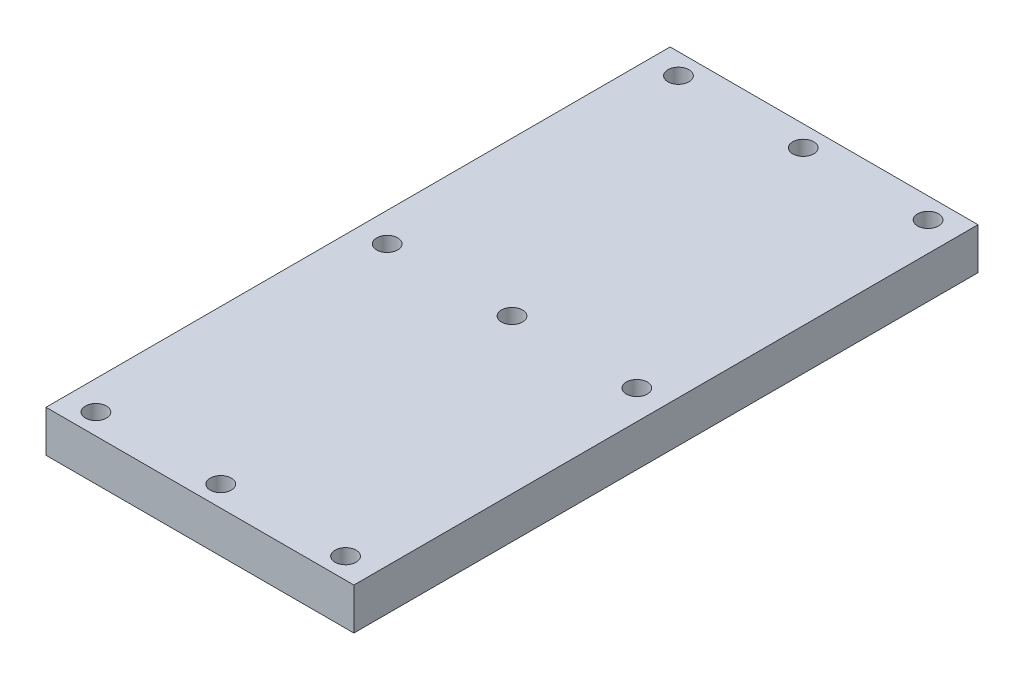
ISO-10303-21;
HEADER;
FILE_DESCRIPTION(('STEP AP214'),'2;1');
FILE_NAME('part.step','',(''),(''),'','','');
FILE_SCHEMA(('AUTOMOTIVE_DESIGN { 1 0 10303 214 1 1 1 1 }'));
ENDSEC;
DATA;
#1=APPLICATION_CONTEXT('core data for automotive mechanical design processes');
#2=APPLICATION_PROTOCOL_DEFINITION('international standard','automotive_design',2000,#1);
#3=PRODUCT_CONTEXT('',#1,'mechanical');
#4=PRODUCT('Part','Part','',(#3));
#5=PRODUCT_RELATED_PRODUCT_CATEGORY('part','',(#4));
#6=PRODUCT_DEFINITION_FORMATION('','',#4);
#7=PRODUCT_DEFINITION_CONTEXT('part definition',#1,'design');
#8=PRODUCT_DEFINITION('design','',#6,#7);
#9=PRODUCT_DEFINITION_SHAPE('','',#8);
#10=(LENGTH_UNIT() NAMED_UNIT(*) SI_UNIT(.MILLI.,.METRE.));
#11=(NAMED_UNIT(*) PLANE_ANGLE_UNIT() SI_UNIT($,.RADIAN.));
#12=(NAMED_UNIT(*) SI_UNIT($,.STERADIAN.) SOLID_ANGLE_UNIT());
#13=UNCERTAINTY_MEASURE_WITH_UNIT(LENGTH_MEASURE(1.E-05),#10,'distance_accuracy_value','');
#14=(GEOMETRIC_REPRESENTATION_CONTEXT(3) GLOBAL_UNCERTAINTY_ASSIGNED_CONTEXT((#13)) GLOBAL_UNIT_ASSIGNED_CONTEXT((#10,
#11,#12)) REPRESENTATION_CONTEXT('',''));
#15=CARTESIAN_POINT('',(0.,0.,0.));
#16=DIRECTION('',(0.,0.,1.));
#17=DIRECTION('',(1.,0.,0.));
#18=AXIS2_PLACEMENT_3D('',#15,#16,#17);
#19=CARTESIAN_POINT('',(0.,5.,0.));
#20=DIRECTION('',(0.,-1.,0.));
#21=DIRECTION('',(0.,0.,-1.));
#22=AXIS2_PLACEMENT_3D('',#19,#20,#21);
#23=PLANE('',#22);
#24=DIRECTION('',(0.,0.,1.));
#25=VECTOR('',#24,1.);
#26=CARTESIAN_POINT('',(0.,5.,0.));
#27=LINE('',#26,#25);
#28=CARTESIAN_POINT('',(0.,5.,-75.));
#29=VERTEX_POINT('',#28);
#30=CARTESIAN_POINT('',(0.,5.,0.));
#31=VERTEX_POINT('',#30);
#32=EDGE_CURVE('E92',#29,#31,#27,.T.);
#33=ORIENTED_EDGE('',*,*,#32,.T.);
#34=DIRECTION('',(1.,0.,0.));
#35=VECTOR('',#34,1.);
#36=CARTESIAN_POINT('',(0.,5.,0.));
#37=LINE('',#36,#35);
#38=CARTESIAN_POINT('',(37.,5.,0.));
#39=VERTEX_POINT('',#38);
#40=EDGE_CURVE('E87',#31,#39,#37,.T.);
#41=ORIENTED_EDGE('',*,*,#40,.T.);
#42=DIRECTION('',(0.,0.,-1.));
#43=VECTOR('',#42,1.);
#44=CARTESIAN_POINT('',(37.,5.,0.));
#45=LINE('',#44,#43);
#46=CARTESIAN_POINT('',(37.,5.,-75.));
#47=VERTEX_POINT('',#46);
#48=EDGE_CURVE('E90',#39,#47,#45,.T.);
#49=ORIENTED_EDGE('',*,*,#48,.T.);
#50=DIRECTION('',(-1.,0.,0.));
#51=VECTOR('',#50,1.);
#52=CARTESIAN_POINT('',(0.,5.,-75.));
#53=LINE('',#52,#51);
#54=EDGE_CURVE('E57',#47,#29,#53,.T.);
#55=ORIENTED_EDGE('',*,*,#54,.T.);
#56=EDGE_LOOP('',(#33,#41,#49,#55));
#57=FACE_BOUND('',#56,.T.);
#58=CARTESIAN_POINT('',(3.5,5.,-72.5));
#59=DIRECTION('',(0.,1.,0.));
#60=DIRECTION('',(0.,0.,1.));
#61=AXIS2_PLACEMENT_3D('',#58,#59,#60);
#62=CIRCLE('',#61,1.265);
#63=CARTESIAN_POINT('',(3.5,5.,-71.235));
#64=VERTEX_POINT('',#63);
#65=EDGE_CURVE('E112',#64,#64,#62,.T.);
#66=ORIENTED_EDGE('',*,*,#65,.F.);
#67=EDGE_LOOP('',(#66));
#68=FACE_BOUND('',#67,.T.);
#69=CARTESIAN_POINT('',(18.5,5.,-72.5));
#70=DIRECTION('',(0.,1.,0.));
#71=DIRECTION('',(0.,0.,1.));
#72=AXIS2_PLACEMENT_3D('',#69,#70,#71);
#73=CIRCLE('',#72,1.265);
#74=CARTESIAN_POINT('',(18.5,5.,-71.235));
#75=VERTEX_POINT('',#74);
#76=EDGE_CURVE('E134',#75,#75,#73,.T.);
#77=ORIENTED_EDGE('',*,*,#76,.F.);
#78=EDGE_LOOP('',(#77));
#79=FACE_BOUND('',#78,.T.);
#80=CARTESIAN_POINT('',(33.5,5.,-72.5));
#81=DIRECTION('',(0.,1.,0.));
#82=DIRECTION('',(0.,0.,1.));
#83=AXIS2_PLACEMENT_3D('',#80,#81,#82);
#84=CIRCLE('',#83,1.265);
#85=CARTESIAN_POINT('',(33.5,5.,-71.235));
#86=VERTEX_POINT('',#85);
#87=EDGE_CURVE('E142',#86,#86,#84,.T.);
#88=ORIENTED_EDGE('',*,*,#87,.F.);
#89=EDGE_LOOP('',(#88));
#90=FACE_BOUND('',#89,.T.);
#91=CARTESIAN_POINT('',(18.5000000000004,5.,-37.5));
#92=DIRECTION('',(0.,1.,0.));
#93=DIRECTION('',(0.,0.,1.));
#94=AXIS2_PLACEMENT_3D('',#91,#92,#93);
#95=CIRCLE('',#94,1.265);
#96=CARTESIAN_POINT('',(18.5000000000004,5.,-36.235));
#97=VERTEX_POINT('',#96);
#98=EDGE_CURVE('E150',#97,#97,#95,.T.);
#99=ORIENTED_EDGE('',*,*,#98,.F.);
#100=EDGE_LOOP('',(#99));
#101=FACE_BOUND('',#100,.T.);
#102=CARTESIAN_POINT('',(33.5000000000004,5.,-37.5));
#103=DIRECTION('',(0.,1.,0.));
#104=DIRECTION('',(0.,0.,1.));
#105=AXIS2_PLACEMENT_3D('',#102,#103,#104);
#106=CIRCLE('',#105,1.265);
#107=CARTESIAN_POINT('',(33.5000000000004,5.,-36.235));
#108=VERTEX_POINT('',#107);
#109=EDGE_CURVE('E158',#108,#108,#106,.T.);
#110=ORIENTED_EDGE('',*,*,#109,.F.);
#111=EDGE_LOOP('',(#110));
#112=FACE_BOUND('',#111,.T.);
#113=CARTESIAN_POINT('',(18.5000000000007,5.,-2.49999999999999));
#114=DIRECTION('',(0.,1.,0.));
#115=DIRECTION('',(0.,0.,1.));
#116=AXIS2_PLACEMENT_3D('',#113,#114,#115);
#117=CIRCLE('',#116,1.265);
#118=CARTESIAN_POINT('',(18.5000000000007,5.,-1.23499999999999));
#119=VERTEX_POINT('',#118);
#120=EDGE_CURVE('E166',#119,#119,#117,.T.);
#121=ORIENTED_EDGE('',*,*,#120,.F.);
#122=EDGE_LOOP('',(#121));
#123=FACE_BOUND('',#122,.T.);
#124=CARTESIAN_POINT('',(33.5000000000007,5.,-2.49999999999999));
#125=DIRECTION('',(0.,1.,0.));
#126=DIRECTION('',(0.,0.,1.));
#127=AXIS2_PLACEMENT_3D('',#124,#125,#126);
#128=CIRCLE('',#127,1.265);
#129=CARTESIAN_POINT('',(33.5000000000007,5.,-1.23499999999999));
#130=VERTEX_POINT('',#129);
#131=EDGE_CURVE('E174',#130,#130,#128,.T.);
#132=ORIENTED_EDGE('',*,*,#131,.F.);
#133=EDGE_LOOP('',(#132));
#134=FACE_BOUND('',#133,.T.);
#135=CARTESIAN_POINT('',(3.50000000000036,5.,-37.5));
#136=DIRECTION('',(0.,1.,0.));
#137=DIRECTION('',(0.,0.,1.));
#138=AXIS2_PLACEMENT_3D('',#135,#136,#137);
#139=CIRCLE('',#138,1.265);
#140=CARTESIAN_POINT('',(3.50000000000036,5.,-36.235));
#141=VERTEX_POINT('',#140);
#142=EDGE_CURVE('E182',#141,#141,#139,.T.);
#143=ORIENTED_EDGE('',*,*,#142,.F.);
#144=EDGE_LOOP('',(#143));
#145=FACE_BOUND('',#144,.T.);
#146=CARTESIAN_POINT('',(3.50000000000073,5.,-2.49999999999999));
#147=DIRECTION('',(0.,1.,0.));
#148=DIRECTION('',(0.,0.,1.));
#149=AXIS2_PLACEMENT_3D('',#146,#147,#148);
#150=CIRCLE('',#149,1.265);
#151=CARTESIAN_POINT('',(3.50000000000073,5.,-1.23499999999999));
#152=VERTEX_POINT('',#151);
#153=EDGE_CURVE('E190',#152,#152,#150,.T.);
#154=ORIENTED_EDGE('',*,*,#153,.F.);
#155=EDGE_LOOP('',(#154));
#156=FACE_BOUND('',#155,.T.);
#157=ADVANCED_FACE('F39',(#57,#68,#79,#90,#101,#112,#123,#134,#145,#156),#23,.F.);
#158=CARTESIAN_POINT('',(0.,0.,0.));
#159=DIRECTION('',(0.,-1.,0.));
#160=DIRECTION('',(0.,0.,-1.));
#161=AXIS2_PLACEMENT_3D('',#158,#159,#160);
#162=PLANE('',#161);
#163=CARTESIAN_POINT('',(3.50000000000036,0.,-37.5));
#164=DIRECTION('',(0.,1.,0.));
#165=DIRECTION('',(0.,0.,1.));
#166=AXIS2_PLACEMENT_3D('',#163,#164,#165);
#167=CIRCLE('',#166,1.265);
#168=CARTESIAN_POINT('',(3.50000000000036,0.,-36.235));
#169=VERTEX_POINT('',#168);
#170=EDGE_CURVE('E186',#169,#169,#167,.T.);
#171=ORIENTED_EDGE('',*,*,#170,.T.);
#172=EDGE_LOOP('',(#171));
#173=FACE_BOUND('',#172,.T.);
#174=CARTESIAN_POINT('',(18.5000000000007,0.,-2.49999999999999));
#175=DIRECTION('',(0.,1.,0.));
#176=DIRECTION('',(0.,0.,1.));
#177=AXIS2_PLACEMENT_3D('',#174,#175,#176);
#178=CIRCLE('',#177,1.265);
#179=CARTESIAN_POINT('',(18.5000000000007,0.,-1.23499999999999));
#180=VERTEX_POINT('',#179);
#181=EDGE_CURVE('E170',#180,#180,#178,.T.);
#182=ORIENTED_EDGE('',*,*,#181,.T.);
#183=EDGE_LOOP('',(#182));
#184=FACE_BOUND('',#183,.T.);
#185=CARTESIAN_POINT('',(18.5000000000004,0.,-37.5));
#186=DIRECTION('',(0.,1.,0.));
#187=DIRECTION('',(0.,0.,1.));
#188=AXIS2_PLACEMENT_3D('',#185,#186,#187);
#189=CIRCLE('',#188,1.265);
#190=CARTESIAN_POINT('',(18.5000000000004,0.,-36.235));
#191=VERTEX_POINT('',#190);
#192=EDGE_CURVE('E154',#191,#191,#189,.T.);
#193=ORIENTED_EDGE('',*,*,#192,.T.);
#194=EDGE_LOOP('',(#193));
#195=FACE_BOUND('',#194,.T.);
#196=CARTESIAN_POINT('',(18.5,0.,-72.5));
#197=DIRECTION('',(0.,1.,0.));
#198=DIRECTION('',(0.,0.,1.));
#199=AXIS2_PLACEMENT_3D('',#196,#197,#198);
#200=CIRCLE('',#199,1.265);
#201=CARTESIAN_POINT('',(18.5,0.,-71.235));
#202=VERTEX_POINT('',#201);
#203=EDGE_CURVE('E138',#202,#202,#200,.T.);
#204=ORIENTED_EDGE('',*,*,#203,.T.);
#205=EDGE_LOOP('',(#204));
#206=FACE_BOUND('',#205,.T.);
#207=DIRECTION('',(0.,0.,1.));
#208=VECTOR('',#207,1.);
#209=CARTESIAN_POINT('',(0.,0.,0.));
#210=LINE('',#209,#208);
#211=CARTESIAN_POINT('',(0.,0.,-75.));
#212=VERTEX_POINT('',#211);
#213=CARTESIAN_POINT('',(0.,0.,0.));
#214=VERTEX_POINT('',#213);
#215=EDGE_CURVE('E108',#212,#214,#210,.T.);
#216=ORIENTED_EDGE('',*,*,#215,.F.);
#217=DIRECTION('',(-1.,0.,0.));
#218=VECTOR('',#217,1.);
#219=CARTESIAN_POINT('',(0.,0.,-75.));
#220=LINE('',#219,#218);
#221=CARTESIAN_POINT('',(37.,0.,-75.));
#222=VERTEX_POINT('',#221);
#223=EDGE_CURVE('E80',#222,#212,#220,.T.);
#224=ORIENTED_EDGE('',*,*,#223,.F.);
#225=DIRECTION('',(0.,0.,-1.));
#226=VECTOR('',#225,1.);
#227=CARTESIAN_POINT('',(37.,0.,0.));
#228=LINE('',#227,#226);
#229=CARTESIAN_POINT('',(37.,0.,0.));
#230=VERTEX_POINT('',#229);
#231=EDGE_CURVE('E74',#230,#222,#228,.T.);
#232=ORIENTED_EDGE('',*,*,#231,.F.);
#233=DIRECTION('',(1.,0.,0.));
#234=VECTOR('',#233,1.);
#235=CARTESIAN_POINT('',(0.,0.,0.));
#236=LINE('',#235,#234);
#237=EDGE_CURVE('E97',#214,#230,#236,.T.);
#238=ORIENTED_EDGE('',*,*,#237,.F.);
#239=EDGE_LOOP('',(#216,#224,#232,#238));
#240=FACE_BOUND('',#239,.T.);
#241=CARTESIAN_POINT('',(3.5,0.,-72.5));
#242=DIRECTION('',(0.,1.,0.));
#243=DIRECTION('',(0.,0.,1.));
#244=AXIS2_PLACEMENT_3D('',#241,#242,#243);
#245=CIRCLE('',#244,1.265);
#246=CARTESIAN_POINT('',(3.5,0.,-71.235));
#247=VERTEX_POINT('',#246);
#248=EDGE_CURVE('E130',#247,#247,#245,.T.);
#249=ORIENTED_EDGE('',*,*,#248,.T.);
#250=EDGE_LOOP('',(#249));
#251=FACE_BOUND('',#250,.T.);
#252=CARTESIAN_POINT('',(33.5,0.,-72.5));
#253=DIRECTION('',(0.,1.,0.));
#254=DIRECTION('',(0.,0.,1.));
#255=AXIS2_PLACEMENT_3D('',#252,#253,#254);
#256=CIRCLE('',#255,1.265);
#257=CARTESIAN_POINT('',(33.5,0.,-71.235));
#258=VERTEX_POINT('',#257);
#259=EDGE_CURVE('E146',#258,#258,#256,.T.);
#260=ORIENTED_EDGE('',*,*,#259,.T.);
#261=EDGE_LOOP('',(#260));
#262=FACE_BOUND('',#261,.T.);
#263=CARTESIAN_POINT('',(33.5000000000004,0.,-37.5));
#264=DIRECTION('',(0.,1.,0.));
#265=DIRECTION('',(0.,0.,1.));
#266=AXIS2_PLACEMENT_3D('',#263,#264,#265);
#267=CIRCLE('',#266,1.265);
#268=CARTESIAN_POINT('',(33.5000000000004,0.,-36.235));
#269=VERTEX_POINT('',#268);
#270=EDGE_CURVE('E162',#269,#269,#267,.T.);
#271=ORIENTED_EDGE('',*,*,#270,.T.);
#272=EDGE_LOOP('',(#271));
#273=FACE_BOUND('',#272,.T.);
#274=CARTESIAN_POINT('',(33.5000000000007,0.,-2.49999999999999));
#275=DIRECTION('',(0.,1.,0.));
#276=DIRECTION('',(0.,0.,1.));
#277=AXIS2_PLACEMENT_3D('',#274,#275,#276);
#278=CIRCLE('',#277,1.265);
#279=CARTESIAN_POINT('',(33.5000000000007,0.,-1.23499999999999));
#280=VERTEX_POINT('',#279);
#281=EDGE_CURVE('E178',#280,#280,#278,.T.);
#282=ORIENTED_EDGE('',*,*,#281,.T.);
#283=EDGE_LOOP('',(#282));
#284=FACE_BOUND('',#283,.T.);
#285=CARTESIAN_POINT('',(3.50000000000073,0.,-2.49999999999999));
#286=DIRECTION('',(0.,1.,0.));
#287=DIRECTION('',(0.,0.,1.));
#288=AXIS2_PLACEMENT_3D('',#285,#286,#287);
#289=CIRCLE('',#288,1.265);
#290=CARTESIAN_POINT('',(3.50000000000073,0.,-1.23499999999999));
#291=VERTEX_POINT('',#290);
#292=EDGE_CURVE('E194',#291,#291,#289,.T.);
#293=ORIENTED_EDGE('',*,*,#292,.T.);
#294=EDGE_LOOP('',(#293));
#295=FACE_BOUND('',#294,.T.);
#296=ADVANCED_FACE('F125',(#173,#184,#195,#206,#240,#251,#262,#273,#284,#295),#162,.T.);
#297=CARTESIAN_POINT('',(0.,5.,0.));
#298=DIRECTION('',(1.,0.,0.));
#299=DIRECTION('',(0.,0.,-1.));
#300=AXIS2_PLACEMENT_3D('',#297,#298,#299);
#301=PLANE('',#300);
#302=ORIENTED_EDGE('',*,*,#215,.T.);
#303=DIRECTION('',(0.,-1.,0.));
#304=VECTOR('',#303,1.);
#305=CARTESIAN_POINT('',(0.,5.,0.));
#306=LINE('',#305,#304);
#307=EDGE_CURVE('E11',#31,#214,#306,.T.);
#308=ORIENTED_EDGE('',*,*,#307,.F.);
#309=ORIENTED_EDGE('',*,*,#32,.F.);
#310=DIRECTION('',(0.,-1.,0.));
#311=VECTOR('',#310,1.);
#312=CARTESIAN_POINT('',(0.,5.,-75.));
#313=LINE('',#312,#311);
#314=EDGE_CURVE('E104',#29,#212,#313,.T.);
#315=ORIENTED_EDGE('',*,*,#314,.T.);
#316=EDGE_LOOP('',(#302,#308,#309,#315));
#317=FACE_BOUND('',#316,.T.);
#318=ADVANCED_FACE('F41',(#317),#301,.F.);
#319=CARTESIAN_POINT('',(0.,5.,0.));
#320=DIRECTION('',(0.,0.,-1.));
#321=DIRECTION('',(-1.,0.,0.));
#322=AXIS2_PLACEMENT_3D('',#319,#320,#321);
#323=PLANE('',#322);
#324=ORIENTED_EDGE('',*,*,#237,.T.);
#325=DIRECTION('',(0.,-1.,0.));
#326=VECTOR('',#325,1.);
#327=CARTESIAN_POINT('',(37.,5.,0.));
#328=LINE('',#327,#326);
#329=EDGE_CURVE('E49',#39,#230,#328,.T.);
#330=ORIENTED_EDGE('',*,*,#329,.F.);
#331=ORIENTED_EDGE('',*,*,#40,.F.);
#332=ORIENTED_EDGE('',*,*,#307,.T.);
#333=EDGE_LOOP('',(#324,#330,#331,#332));
#334=FACE_BOUND('',#333,.T.);
#335=ADVANCED_FACE('F96',(#334),#323,.F.);
#336=CARTESIAN_POINT('',(37.,5.,0.));
#337=DIRECTION('',(-1.,0.,0.));
#338=DIRECTION('',(0.,0.,1.));
#339=AXIS2_PLACEMENT_3D('',#336,#337,#338);
#340=PLANE('',#339);
#341=ORIENTED_EDGE('',*,*,#231,.T.);
#342=DIRECTION('',(0.,-1.,0.));
#343=VECTOR('',#342,1.);
#344=CARTESIAN_POINT('',(37.,5.,-75.));
#345=LINE('',#344,#343);
#346=EDGE_CURVE('E99',#47,#222,#345,.T.);
#347=ORIENTED_EDGE('',*,*,#346,.F.);
#348=ORIENTED_EDGE('',*,*,#48,.F.);
#349=ORIENTED_EDGE('',*,*,#329,.T.);
#350=EDGE_LOOP('',(#341,#347,#348,#349));
#351=FACE_BOUND('',#350,.T.);
#352=ADVANCED_FACE('F100',(#351),#340,.F.);
#353=CARTESIAN_POINT('',(0.,5.,-75.));
#354=DIRECTION('',(0.,0.,1.));
#355=DIRECTION('',(1.,0.,0.));
#356=AXIS2_PLACEMENT_3D('',#353,#354,#355);
#357=PLANE('',#356);
#358=ORIENTED_EDGE('',*,*,#223,.T.);
#359=ORIENTED_EDGE('',*,*,#314,.F.);
#360=ORIENTED_EDGE('',*,*,#54,.F.);
#361=ORIENTED_EDGE('',*,*,#346,.T.);
#362=EDGE_LOOP('',(#358,#359,#360,#361));
#363=FACE_BOUND('',#362,.T.);
#364=ADVANCED_FACE('F122',(#363),#357,.F.);
#365=CARTESIAN_POINT('',(3.5,5.,-72.5));
#366=DIRECTION('',(0.,-1.,0.));
#367=DIRECTION('',(0.,0.,-1.));
#368=AXIS2_PLACEMENT_3D('',#365,#366,#367);
#369=CYLINDRICAL_SURFACE('',#368,1.265);
#370=ORIENTED_EDGE('',*,*,#65,.T.);
#371=EDGE_LOOP('',(#370));
#372=FACE_BOUND('',#371,.T.);
#373=ORIENTED_EDGE('',*,*,#248,.F.);
#374=EDGE_LOOP('',(#373));
#375=FACE_BOUND('',#374,.T.);
#376=ADVANCED_FACE('F213',(#372,#375),#369,.F.);
#377=CARTESIAN_POINT('',(18.5,5.,-72.5));
#378=DIRECTION('',(0.,-1.,0.));
#379=DIRECTION('',(0.,0.,-1.));
#380=AXIS2_PLACEMENT_3D('',#377,#378,#379);
#381=CYLINDRICAL_SURFACE('',#380,1.265);
#382=ORIENTED_EDGE('',*,*,#76,.T.);
#383=EDGE_LOOP('',(#382));
#384=FACE_BOUND('',#383,.T.);
#385=ORIENTED_EDGE('',*,*,#203,.F.);
#386=EDGE_LOOP('',(#385));
#387=FACE_BOUND('',#386,.T.);
#388=ADVANCED_FACE('F259',(#384,#387),#381,.F.);
#389=CARTESIAN_POINT('',(33.5,5.,-72.5));
#390=DIRECTION('',(0.,-1.,0.));
#391=DIRECTION('',(0.,0.,-1.));
#392=AXIS2_PLACEMENT_3D('',#389,#390,#391);
#393=CYLINDRICAL_SURFACE('',#392,1.265);
#394=ORIENTED_EDGE('',*,*,#87,.T.);
#395=EDGE_LOOP('',(#394));
#396=FACE_BOUND('',#395,.T.);
#397=ORIENTED_EDGE('',*,*,#259,.F.);
#398=EDGE_LOOP('',(#397));
#399=FACE_BOUND('',#398,.T.);
#400=ADVANCED_FACE('F267',(#396,#399),#393,.F.);
#401=CARTESIAN_POINT('',(18.5000000000004,5.,-37.5));
#402=DIRECTION('',(0.,-1.,0.));
#403=DIRECTION('',(0.,0.,-1.));
#404=AXIS2_PLACEMENT_3D('',#401,#402,#403);
#405=CYLINDRICAL_SURFACE('',#404,1.265);
#406=ORIENTED_EDGE('',*,*,#98,.T.);
#407=EDGE_LOOP('',(#406));
#408=FACE_BOUND('',#407,.T.);
#409=ORIENTED_EDGE('',*,*,#192,.F.);
#410=EDGE_LOOP('',(#409));
#411=FACE_BOUND('',#410,.T.);
#412=ADVANCED_FACE('F275',(#408,#411),#405,.F.);
#413=CARTESIAN_POINT('',(33.5000000000004,5.,-37.5));
#414=DIRECTION('',(0.,-1.,0.));
#415=DIRECTION('',(0.,0.,-1.));
#416=AXIS2_PLACEMENT_3D('',#413,#414,#415);
#417=CYLINDRICAL_SURFACE('',#416,1.265);
#418=ORIENTED_EDGE('',*,*,#109,.T.);
#419=EDGE_LOOP('',(#418));
#420=FACE_BOUND('',#419,.T.);
#421=ORIENTED_EDGE('',*,*,#270,.F.);
#422=EDGE_LOOP('',(#421));
#423=FACE_BOUND('',#422,.T.);
#424=ADVANCED_FACE('F284',(#420,#423),#417,.F.);
#425=CARTESIAN_POINT('',(18.5000000000007,5.,-2.49999999999999));
#426=DIRECTION('',(0.,-1.,0.));
#427=DIRECTION('',(0.,0.,-1.));
#428=AXIS2_PLACEMENT_3D('',#425,#426,#427);
#429=CYLINDRICAL_SURFACE('',#428,1.265);
#430=ORIENTED_EDGE('',*,*,#120,.T.);
#431=EDGE_LOOP('',(#430));
#432=FACE_BOUND('',#431,.T.);
#433=ORIENTED_EDGE('',*,*,#181,.F.);
#434=EDGE_LOOP('',(#433));
#435=FACE_BOUND('',#434,.T.);
#436=ADVANCED_FACE('F293',(#432,#435),#429,.F.);
#437=CARTESIAN_POINT('',(33.5000000000007,5.,-2.49999999999999));
#438=DIRECTION('',(0.,-1.,0.));
#439=DIRECTION('',(0.,0.,-1.));
#440=AXIS2_PLACEMENT_3D('',#437,#438,#439);
#441=CYLINDRICAL_SURFACE('',#440,1.265);
#442=ORIENTED_EDGE('',*,*,#131,.T.);
#443=EDGE_LOOP('',(#442));
#444=FACE_BOUND('',#443,.T.);
#445=ORIENTED_EDGE('',*,*,#281,.F.);
#446=EDGE_LOOP('',(#445));
#447=FACE_BOUND('',#446,.T.);
#448=ADVANCED_FACE('F302',(#444,#447),#441,.F.);
#449=CARTESIAN_POINT('',(3.50000000000036,5.,-37.5));
#450=DIRECTION('',(0.,-1.,0.));
#451=DIRECTION('',(0.,0.,-1.));
#452=AXIS2_PLACEMENT_3D('',#449,#450,#451);
#453=CYLINDRICAL_SURFACE('',#452,1.265);
#454=ORIENTED_EDGE('',*,*,#142,.T.);
#455=EDGE_LOOP('',(#454));
#456=FACE_BOUND('',#455,.T.);
#457=ORIENTED_EDGE('',*,*,#170,.F.);
#458=EDGE_LOOP('',(#457));
#459=FACE_BOUND('',#458,.T.);
#460=ADVANCED_FACE('F311',(#456,#459),#453,.F.);
#461=CARTESIAN_POINT('',(3.50000000000073,5.,-2.49999999999999));
#462=DIRECTION('',(0.,-1.,0.));
#463=DIRECTION('',(0.,0.,-1.));
#464=AXIS2_PLACEMENT_3D('',#461,#462,#463);
#465=CYLINDRICAL_SURFACE('',#464,1.265);
#466=ORIENTED_EDGE('',*,*,#153,.T.);
#467=EDGE_LOOP('',(#466));
#468=FACE_BOUND('',#467,.T.);
#469=ORIENTED_EDGE('',*,*,#292,.F.);
#470=EDGE_LOOP('',(#469));
#471=FACE_BOUND('',#470,.T.);
#472=ADVANCED_FACE('F202',(#468,#471),#465,.F.);
#473=CLOSED_SHELL('',(#157,#296,#318,#335,#352,#364,#376,#388,#400,#412,#424,#436,#448,#460,#472));
#474=MANIFOLD_SOLID_BREP('B2',#473);
#475=ADVANCED_BREP_SHAPE_REPRESENTATION('',(#18,#474),#14);
#476=SHAPE_DEFINITION_REPRESENTATION(#9,#475);
ENDSEC;
END-ISO-10303-21;
